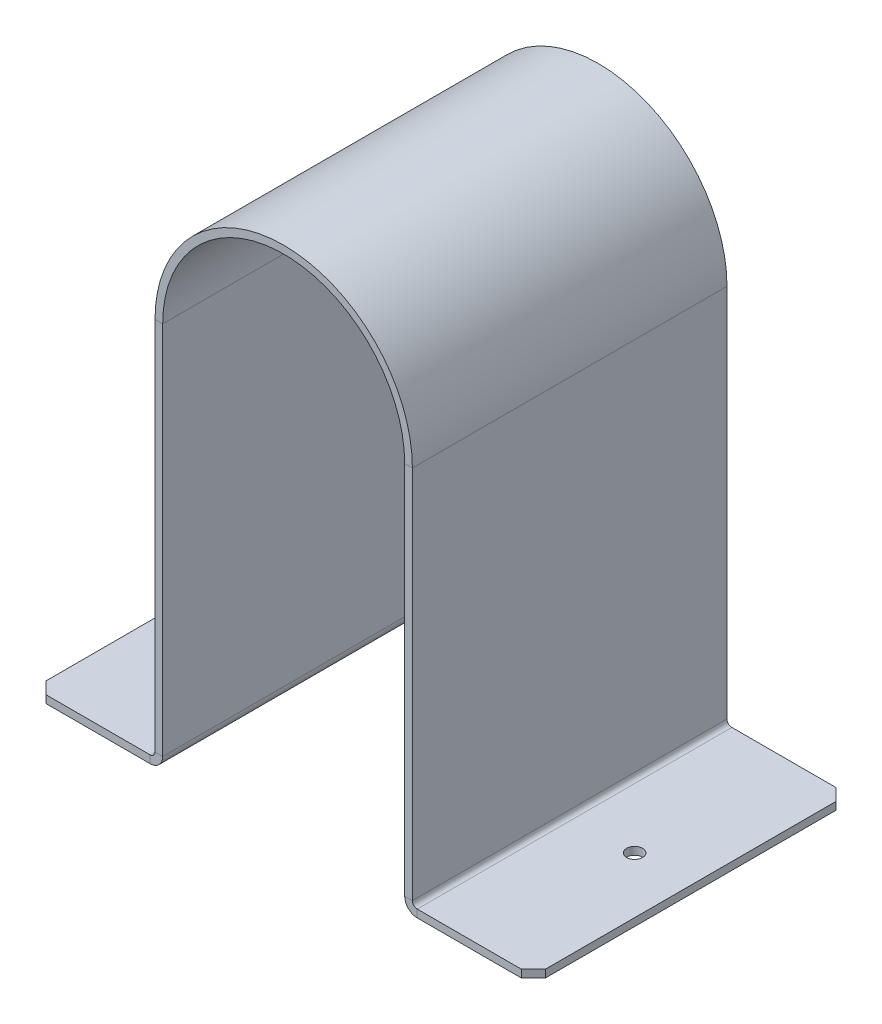
ISO-10303-21;
HEADER;
FILE_DESCRIPTION(('STEP AP214'),'2;1');
FILE_NAME('part.step','',(''),(''),'','','');
FILE_SCHEMA(('AUTOMOTIVE_DESIGN { 1 0 10303 214 1 1 1 1 }'));
ENDSEC;
DATA;
#1=APPLICATION_CONTEXT('core data for automotive mechanical design processes');
#2=APPLICATION_PROTOCOL_DEFINITION('international standard','automotive_design',2000,#1);
#3=PRODUCT_CONTEXT('',#1,'mechanical');
#4=PRODUCT('Part','Part','',(#3));
#5=PRODUCT_RELATED_PRODUCT_CATEGORY('part','',(#4));
#6=PRODUCT_DEFINITION_FORMATION('','',#4);
#7=PRODUCT_DEFINITION_CONTEXT('part definition',#1,'design');
#8=PRODUCT_DEFINITION('design','',#6,#7);
#9=PRODUCT_DEFINITION_SHAPE('','',#8);
#10=(LENGTH_UNIT() NAMED_UNIT(*) SI_UNIT(.MILLI.,.METRE.));
#11=(NAMED_UNIT(*) PLANE_ANGLE_UNIT() SI_UNIT($,.RADIAN.));
#12=(NAMED_UNIT(*) SI_UNIT($,.STERADIAN.) SOLID_ANGLE_UNIT());
#13=UNCERTAINTY_MEASURE_WITH_UNIT(LENGTH_MEASURE(1.E-05),#10,'distance_accuracy_value','');
#14=(GEOMETRIC_REPRESENTATION_CONTEXT(3) GLOBAL_UNCERTAINTY_ASSIGNED_CONTEXT((#13)) GLOBAL_UNIT_ASSIGNED_CONTEXT((#10,
#11,#12)) REPRESENTATION_CONTEXT('',''));
#15=CARTESIAN_POINT('',(0.,0.,0.));
#16=DIRECTION('',(0.,0.,1.));
#17=DIRECTION('',(1.,0.,0.));
#18=AXIS2_PLACEMENT_3D('',#15,#16,#17);
#19=CARTESIAN_POINT('',(53.175,0.,130.));
#20=DIRECTION('',(0.,0.,1.));
#21=DIRECTION('',(1.,0.,0.));
#22=AXIS2_PLACEMENT_3D('',#19,#20,#21);
#23=PLANE('',#22);
#24=DIRECTION('',(0.,-1.,0.));
#25=VECTOR('',#24,1.);
#26=CARTESIAN_POINT('',(-53.175,0.,130.));
#27=LINE('',#26,#25);
#28=CARTESIAN_POINT('',(-53.175,0.,130.));
#29=VERTEX_POINT('',#28);
#30=CARTESIAN_POINT('',(-53.175,-154.825,130.));
#31=VERTEX_POINT('',#30);
#32=EDGE_CURVE('E330',#29,#31,#27,.T.);
#33=ORIENTED_EDGE('',*,*,#32,.T.);
#34=DIRECTION('',(1.,0.,0.));
#35=VECTOR('',#34,1.);
#36=CARTESIAN_POINT('',(-53.175,-154.825,130.));
#37=LINE('',#36,#35);
#38=CARTESIAN_POINT('',(-50.,-154.825,130.));
#39=VERTEX_POINT('',#38);
#40=EDGE_CURVE('E270',#31,#39,#37,.T.);
#41=ORIENTED_EDGE('',*,*,#40,.T.);
#42=DIRECTION('',(0.,-1.,0.));
#43=VECTOR('',#42,1.);
#44=CARTESIAN_POINT('',(-50.,0.,130.));
#45=LINE('',#44,#43);
#46=CARTESIAN_POINT('',(-50.,0.,130.));
#47=VERTEX_POINT('',#46);
#48=EDGE_CURVE('E333',#47,#39,#45,.T.);
#49=ORIENTED_EDGE('',*,*,#48,.F.);
#50=DIRECTION('',(-1.,0.,0.));
#51=VECTOR('',#50,1.);
#52=CARTESIAN_POINT('',(-50.,0.,130.));
#53=LINE('',#52,#51);
#54=EDGE_CURVE('E381',#47,#29,#53,.T.);
#55=ORIENTED_EDGE('',*,*,#54,.T.);
#56=EDGE_LOOP('',(#33,#41,#49,#55));
#57=FACE_BOUND('',#56,.T.);
#58=ADVANCED_FACE('F81',(#57),#23,.T.);
#59=CARTESIAN_POINT('',(-53.175,0.,130.));
#60=DIRECTION('',(1.,0.,0.));
#61=DIRECTION('',(0.,1.,0.));
#62=AXIS2_PLACEMENT_3D('',#59,#60,#61);
#63=PLANE('',#62);
#64=DIRECTION('',(0.,0.,1.));
#65=VECTOR('',#64,1.);
#66=CARTESIAN_POINT('',(-53.175,-154.825,130.));
#67=LINE('',#66,#65);
#68=CARTESIAN_POINT('',(-53.175,-154.825,0.));
#69=VERTEX_POINT('',#68);
#70=EDGE_CURVE('E274',#31,#69,#67,.F.);
#71=ORIENTED_EDGE('',*,*,#70,.F.);
#72=ORIENTED_EDGE('',*,*,#32,.F.);
#73=DIRECTION('',(0.,0.,-1.));
#74=VECTOR('',#73,1.);
#75=CARTESIAN_POINT('',(-53.175,0.,130.));
#76=LINE('',#75,#74);
#77=CARTESIAN_POINT('',(-53.175,0.,0.));
#78=VERTEX_POINT('',#77);
#79=EDGE_CURVE('E347',#29,#78,#76,.T.);
#80=ORIENTED_EDGE('',*,*,#79,.T.);
#81=DIRECTION('',(0.,-1.,0.));
#82=VECTOR('',#81,1.);
#83=CARTESIAN_POINT('',(-53.175,0.,0.));
#84=LINE('',#83,#82);
#85=EDGE_CURVE('E327',#78,#69,#84,.T.);
#86=ORIENTED_EDGE('',*,*,#85,.T.);
#87=EDGE_LOOP('',(#71,#72,#80,#86));
#88=FACE_BOUND('',#87,.T.);
#89=ADVANCED_FACE('F454',(#88),#63,.F.);
#90=CARTESIAN_POINT('',(-50.,0.,130.));
#91=DIRECTION('',(1.,0.,0.));
#92=DIRECTION('',(0.,1.,0.));
#93=AXIS2_PLACEMENT_3D('',#90,#91,#92);
#94=PLANE('',#93);
#95=ORIENTED_EDGE('',*,*,#48,.T.);
#96=DIRECTION('',(0.,0.,1.));
#97=VECTOR('',#96,1.);
#98=CARTESIAN_POINT('',(-50.,-154.825,130.));
#99=LINE('',#98,#97);
#100=CARTESIAN_POINT('',(-50.,-154.825,0.));
#101=VERTEX_POINT('',#100);
#102=EDGE_CURVE('E241',#39,#101,#99,.F.);
#103=ORIENTED_EDGE('',*,*,#102,.T.);
#104=DIRECTION('',(0.,-1.,0.));
#105=VECTOR('',#104,1.);
#106=CARTESIAN_POINT('',(-50.,0.,0.));
#107=LINE('',#106,#105);
#108=CARTESIAN_POINT('',(-50.,0.,0.));
#109=VERTEX_POINT('',#108);
#110=EDGE_CURVE('E350',#109,#101,#107,.T.);
#111=ORIENTED_EDGE('',*,*,#110,.F.);
#112=DIRECTION('',(0.,0.,-1.));
#113=VECTOR('',#112,1.);
#114=CARTESIAN_POINT('',(-50.,0.,130.));
#115=LINE('',#114,#113);
#116=EDGE_CURVE('E370',#47,#109,#115,.T.);
#117=ORIENTED_EDGE('',*,*,#116,.F.);
#118=EDGE_LOOP('',(#95,#103,#111,#117));
#119=FACE_BOUND('',#118,.T.);
#120=ADVANCED_FACE('F473',(#119),#94,.T.);
#121=CARTESIAN_POINT('',(0.,0.,0.));
#122=DIRECTION('',(0.,0.,1.));
#123=DIRECTION('',(1.,0.,0.));
#124=AXIS2_PLACEMENT_3D('',#121,#122,#123);
#125=PLANE('',#124);
#126=DIRECTION('',(1.,0.,0.));
#127=VECTOR('',#126,1.);
#128=CARTESIAN_POINT('',(-53.175,-154.825,0.));
#129=LINE('',#128,#127);
#130=EDGE_CURVE('E277',#69,#101,#129,.T.);
#131=ORIENTED_EDGE('',*,*,#130,.F.);
#132=ORIENTED_EDGE('',*,*,#85,.F.);
#133=DIRECTION('',(1.,0.,0.));
#134=VECTOR('',#133,1.);
#135=CARTESIAN_POINT('',(-53.175,0.,0.));
#136=LINE('',#135,#134);
#137=EDGE_CURVE('E373',#78,#109,#136,.T.);
#138=ORIENTED_EDGE('',*,*,#137,.T.);
#139=ORIENTED_EDGE('',*,*,#110,.T.);
#140=EDGE_LOOP('',(#131,#132,#138,#139));
#141=FACE_BOUND('',#140,.T.);
#142=ADVANCED_FACE('F451',(#141),#125,.F.);
#143=CARTESIAN_POINT('',(-53.175,0.,0.));
#144=DIRECTION('',(0.,0.,-1.));
#145=DIRECTION('',(-1.,0.,0.));
#146=AXIS2_PLACEMENT_3D('',#143,#144,#145);
#147=PLANE('',#146);
#148=DIRECTION('',(0.,1.,0.));
#149=VECTOR('',#148,1.);
#150=CARTESIAN_POINT('',(53.175,0.,0.));
#151=LINE('',#150,#149);
#152=CARTESIAN_POINT('',(53.175,-154.825,0.));
#153=VERTEX_POINT('',#152);
#154=CARTESIAN_POINT('',(53.175,0.,0.));
#155=VERTEX_POINT('',#154);
#156=EDGE_CURVE('E358',#153,#155,#151,.T.);
#157=ORIENTED_EDGE('',*,*,#156,.F.);
#158=DIRECTION('',(-1.,0.,0.));
#159=VECTOR('',#158,1.);
#160=CARTESIAN_POINT('',(53.175,-154.825,0.));
#161=LINE('',#160,#159);
#162=CARTESIAN_POINT('',(50.,-154.825,0.));
#163=VERTEX_POINT('',#162);
#164=EDGE_CURVE('E314',#153,#163,#161,.T.);
#165=ORIENTED_EDGE('',*,*,#164,.T.);
#166=DIRECTION('',(0.,1.,0.));
#167=VECTOR('',#166,1.);
#168=CARTESIAN_POINT('',(50.,0.,0.));
#169=LINE('',#168,#167);
#170=CARTESIAN_POINT('',(50.,0.,0.));
#171=VERTEX_POINT('',#170);
#172=EDGE_CURVE('E356',#163,#171,#169,.T.);
#173=ORIENTED_EDGE('',*,*,#172,.T.);
#174=DIRECTION('',(1.,0.,0.));
#175=VECTOR('',#174,1.);
#176=CARTESIAN_POINT('',(50.,0.,0.));
#177=LINE('',#176,#175);
#178=EDGE_CURVE('E375',#171,#155,#177,.T.);
#179=ORIENTED_EDGE('',*,*,#178,.T.);
#180=EDGE_LOOP('',(#157,#165,#173,#179));
#181=FACE_BOUND('',#180,.T.);
#182=ADVANCED_FACE('F486',(#181),#147,.T.);
#183=CARTESIAN_POINT('',(50.,0.,130.));
#184=DIRECTION('',(-1.,0.,0.));
#185=DIRECTION('',(0.,-1.,0.));
#186=AXIS2_PLACEMENT_3D('',#183,#184,#185);
#187=PLANE('',#186);
#188=ORIENTED_EDGE('',*,*,#172,.F.);
#189=DIRECTION('',(0.,0.,-1.));
#190=VECTOR('',#189,1.);
#191=CARTESIAN_POINT('',(50.,-154.825,0.));
#192=LINE('',#191,#190);
#193=CARTESIAN_POINT('',(50.,-154.825,130.));
#194=VERTEX_POINT('',#193);
#195=EDGE_CURVE('E307',#163,#194,#192,.F.);
#196=ORIENTED_EDGE('',*,*,#195,.T.);
#197=DIRECTION('',(0.,1.,0.));
#198=VECTOR('',#197,1.);
#199=CARTESIAN_POINT('',(50.,0.,130.));
#200=LINE('',#199,#198);
#201=CARTESIAN_POINT('',(50.,0.,130.));
#202=VERTEX_POINT('',#201);
#203=EDGE_CURVE('E340',#194,#202,#200,.T.);
#204=ORIENTED_EDGE('',*,*,#203,.T.);
#205=DIRECTION('',(0.,0.,-1.));
#206=VECTOR('',#205,1.);
#207=CARTESIAN_POINT('',(50.,0.,130.));
#208=LINE('',#207,#206);
#209=EDGE_CURVE('E367',#202,#171,#208,.T.);
#210=ORIENTED_EDGE('',*,*,#209,.T.);
#211=EDGE_LOOP('',(#188,#196,#204,#210));
#212=FACE_BOUND('',#211,.T.);
#213=ADVANCED_FACE('F489',(#212),#187,.T.);
#214=CARTESIAN_POINT('',(53.175,0.,130.));
#215=DIRECTION('',(-1.,0.,0.));
#216=DIRECTION('',(0.,-1.,0.));
#217=AXIS2_PLACEMENT_3D('',#214,#215,#216);
#218=PLANE('',#217);
#219=DIRECTION('',(0.,0.,-1.));
#220=VECTOR('',#219,1.);
#221=CARTESIAN_POINT('',(53.175,-154.825,0.));
#222=LINE('',#221,#220);
#223=CARTESIAN_POINT('',(53.175,-154.825,130.));
#224=VERTEX_POINT('',#223);
#225=EDGE_CURVE('E320',#153,#224,#222,.F.);
#226=ORIENTED_EDGE('',*,*,#225,.F.);
#227=ORIENTED_EDGE('',*,*,#156,.T.);
#228=DIRECTION('',(0.,0.,-1.));
#229=VECTOR('',#228,1.);
#230=CARTESIAN_POINT('',(53.175,0.,130.));
#231=LINE('',#230,#229);
#232=CARTESIAN_POINT('',(53.175,0.,130.));
#233=VERTEX_POINT('',#232);
#234=EDGE_CURVE('E364',#233,#155,#231,.T.);
#235=ORIENTED_EDGE('',*,*,#234,.F.);
#236=DIRECTION('',(0.,1.,0.));
#237=VECTOR('',#236,1.);
#238=CARTESIAN_POINT('',(53.175,0.,130.));
#239=LINE('',#238,#237);
#240=EDGE_CURVE('E342',#224,#233,#239,.T.);
#241=ORIENTED_EDGE('',*,*,#240,.F.);
#242=EDGE_LOOP('',(#226,#227,#235,#241));
#243=FACE_BOUND('',#242,.T.);
#244=ADVANCED_FACE('F483',(#243),#218,.F.);
#245=CARTESIAN_POINT('',(-50.,0.,130.));
#246=DIRECTION('',(0.,0.,1.));
#247=DIRECTION('',(1.,0.,0.));
#248=AXIS2_PLACEMENT_3D('',#245,#246,#247);
#249=PLANE('',#248);
#250=ORIENTED_EDGE('',*,*,#54,.F.);
#251=CARTESIAN_POINT('',(0.,0.,130.));
#252=DIRECTION('',(0.,0.,1.));
#253=DIRECTION('',(1.,0.,0.));
#254=AXIS2_PLACEMENT_3D('',#251,#252,#253);
#255=CIRCLE('',#254,50.);
#256=EDGE_CURVE('E337',#202,#47,#255,.T.);
#257=ORIENTED_EDGE('',*,*,#256,.F.);
#258=DIRECTION('',(-1.,0.,0.));
#259=VECTOR('',#258,1.);
#260=CARTESIAN_POINT('',(53.175,0.,130.));
#261=LINE('',#260,#259);
#262=EDGE_CURVE('E378',#233,#202,#261,.T.);
#263=ORIENTED_EDGE('',*,*,#262,.F.);
#264=CARTESIAN_POINT('',(0.,0.,130.));
#265=DIRECTION('',(0.,0.,1.));
#266=DIRECTION('',(1.,0.,0.));
#267=AXIS2_PLACEMENT_3D('',#264,#265,#266);
#268=CIRCLE('',#267,53.175);
#269=EDGE_CURVE('E344',#233,#29,#268,.T.);
#270=ORIENTED_EDGE('',*,*,#269,.T.);
#271=EDGE_LOOP('',(#250,#257,#263,#270));
#272=FACE_BOUND('',#271,.T.);
#273=ADVANCED_FACE('F477',(#272),#249,.T.);
#274=CARTESIAN_POINT('',(50.,0.,0.));
#275=DIRECTION('',(0.,0.,-1.));
#276=DIRECTION('',(-1.,0.,0.));
#277=AXIS2_PLACEMENT_3D('',#274,#275,#276);
#278=PLANE('',#277);
#279=ORIENTED_EDGE('',*,*,#178,.F.);
#280=CARTESIAN_POINT('',(0.,0.,0.));
#281=DIRECTION('',(0.,0.,1.));
#282=DIRECTION('',(1.,0.,0.));
#283=AXIS2_PLACEMENT_3D('',#280,#281,#282);
#284=CIRCLE('',#283,50.);
#285=EDGE_CURVE('E353',#171,#109,#284,.T.);
#286=ORIENTED_EDGE('',*,*,#285,.T.);
#287=ORIENTED_EDGE('',*,*,#137,.F.);
#288=CARTESIAN_POINT('',(0.,0.,0.));
#289=DIRECTION('',(0.,0.,1.));
#290=DIRECTION('',(1.,0.,0.));
#291=AXIS2_PLACEMENT_3D('',#288,#289,#290);
#292=CIRCLE('',#291,53.175);
#293=EDGE_CURVE('E334',#155,#78,#292,.T.);
#294=ORIENTED_EDGE('',*,*,#293,.F.);
#295=EDGE_LOOP('',(#279,#286,#287,#294));
#296=FACE_BOUND('',#295,.T.);
#297=ADVANCED_FACE('F464',(#296),#278,.T.);
#298=CARTESIAN_POINT('',(0.,0.,130.));
#299=DIRECTION('',(0.,0.,-1.));
#300=DIRECTION('',(-1.,0.,0.));
#301=AXIS2_PLACEMENT_3D('',#298,#299,#300);
#302=CYLINDRICAL_SURFACE('',#301,50.);
#303=ORIENTED_EDGE('',*,*,#285,.F.);
#304=ORIENTED_EDGE('',*,*,#209,.F.);
#305=ORIENTED_EDGE('',*,*,#256,.T.);
#306=ORIENTED_EDGE('',*,*,#116,.T.);
#307=EDGE_LOOP('',(#303,#304,#305,#306));
#308=FACE_BOUND('',#307,.T.);
#309=ADVANCED_FACE('F468',(#308),#302,.F.);
#310=CARTESIAN_POINT('',(0.,0.,130.));
#311=DIRECTION('',(0.,0.,-1.));
#312=DIRECTION('',(-1.,0.,0.));
#313=AXIS2_PLACEMENT_3D('',#310,#311,#312);
#314=CYLINDRICAL_SURFACE('',#313,53.175);
#315=ORIENTED_EDGE('',*,*,#293,.T.);
#316=ORIENTED_EDGE('',*,*,#79,.F.);
#317=ORIENTED_EDGE('',*,*,#269,.F.);
#318=ORIENTED_EDGE('',*,*,#234,.T.);
#319=EDGE_LOOP('',(#315,#316,#317,#318));
#320=FACE_BOUND('',#319,.T.);
#321=ADVANCED_FACE('F459',(#320),#314,.T.);
#322=CARTESIAN_POINT('',(0.,0.,130.));
#323=DIRECTION('',(0.,0.,1.));
#324=DIRECTION('',(1.,0.,0.));
#325=AXIS2_PLACEMENT_3D('',#322,#323,#324);
#326=PLANE('',#325);
#327=DIRECTION('',(-1.,0.,0.));
#328=VECTOR('',#327,1.);
#329=CARTESIAN_POINT('',(53.175,-154.825,130.));
#330=LINE('',#329,#328);
#331=EDGE_CURVE('E324',#224,#194,#330,.T.);
#332=ORIENTED_EDGE('',*,*,#331,.F.);
#333=ORIENTED_EDGE('',*,*,#240,.T.);
#334=ORIENTED_EDGE('',*,*,#262,.T.);
#335=ORIENTED_EDGE('',*,*,#203,.F.);
#336=EDGE_LOOP('',(#332,#333,#334,#335));
#337=FACE_BOUND('',#336,.T.);
#338=ADVANCED_FACE('F491',(#337),#326,.T.);
#339=CARTESIAN_POINT('',(55.175,-154.825,130.));
#340=DIRECTION('',(0.,0.,1.));
#341=DIRECTION('',(1.,0.,0.));
#342=AXIS2_PLACEMENT_3D('',#339,#340,#341);
#343=PLANE('',#342);
#344=DIRECTION('',(0.,1.,0.));
#345=VECTOR('',#344,1.);
#346=CARTESIAN_POINT('',(55.175,-160.,130.));
#347=LINE('',#346,#345);
#348=CARTESIAN_POINT('',(55.175,-156.825,130.));
#349=VERTEX_POINT('',#348);
#350=CARTESIAN_POINT('',(55.175,-160.,130.));
#351=VERTEX_POINT('',#350);
#352=EDGE_CURVE('E280',#349,#351,#347,.F.);
#353=ORIENTED_EDGE('',*,*,#352,.F.);
#354=CARTESIAN_POINT('',(55.175,-154.825,130.));
#355=DIRECTION('',(0.,0.,-1.));
#356=DIRECTION('',(-1.,0.,0.));
#357=AXIS2_PLACEMENT_3D('',#354,#355,#356);
#358=CIRCLE('',#357,2.);
#359=EDGE_CURVE('E317',#224,#349,#358,.F.);
#360=ORIENTED_EDGE('',*,*,#359,.F.);
#361=ORIENTED_EDGE('',*,*,#331,.T.);
#362=CARTESIAN_POINT('',(55.175,-154.825,130.));
#363=DIRECTION('',(0.,0.,-1.));
#364=DIRECTION('',(-1.,0.,0.));
#365=AXIS2_PLACEMENT_3D('',#362,#363,#364);
#366=CIRCLE('',#365,5.175);
#367=EDGE_CURVE('E310',#194,#351,#366,.F.);
#368=ORIENTED_EDGE('',*,*,#367,.T.);
#369=EDGE_LOOP('',(#353,#360,#361,#368));
#370=FACE_BOUND('',#369,.T.);
#371=ADVANCED_FACE('F495',(#370),#343,.T.);
#372=CARTESIAN_POINT('',(55.175,-154.825,0.));
#373=DIRECTION('',(0.,0.,1.));
#374=DIRECTION('',(1.,0.,0.));
#375=AXIS2_PLACEMENT_3D('',#372,#373,#374);
#376=PLANE('',#375);
#377=CARTESIAN_POINT('',(55.175,-154.825,0.));
#378=DIRECTION('',(0.,0.,-1.));
#379=DIRECTION('',(-1.,0.,0.));
#380=AXIS2_PLACEMENT_3D('',#377,#378,#379);
#381=CIRCLE('',#380,2.);
#382=CARTESIAN_POINT('',(55.175,-156.825,0.));
#383=VERTEX_POINT('',#382);
#384=EDGE_CURVE('E284',#383,#153,#381,.T.);
#385=ORIENTED_EDGE('',*,*,#384,.F.);
#386=DIRECTION('',(0.,1.,0.));
#387=VECTOR('',#386,1.);
#388=CARTESIAN_POINT('',(55.175,-156.825,0.));
#389=LINE('',#388,#387);
#390=CARTESIAN_POINT('',(55.175,-160.,0.));
#391=VERTEX_POINT('',#390);
#392=EDGE_CURVE('E300',#383,#391,#389,.F.);
#393=ORIENTED_EDGE('',*,*,#392,.T.);
#394=CARTESIAN_POINT('',(55.175,-154.825,0.));
#395=DIRECTION('',(0.,0.,-1.));
#396=DIRECTION('',(-1.,0.,0.));
#397=AXIS2_PLACEMENT_3D('',#394,#395,#396);
#398=CIRCLE('',#397,5.175);
#399=EDGE_CURVE('E311',#391,#163,#398,.T.);
#400=ORIENTED_EDGE('',*,*,#399,.T.);
#401=ORIENTED_EDGE('',*,*,#164,.F.);
#402=EDGE_LOOP('',(#385,#393,#400,#401));
#403=FACE_BOUND('',#402,.T.);
#404=ADVANCED_FACE('F608',(#403),#376,.F.);
#405=CARTESIAN_POINT('',(55.175,-154.825,0.));
#406=DIRECTION('',(0.,0.,-1.));
#407=DIRECTION('',(0.,-1.,0.));
#408=AXIS2_PLACEMENT_3D('',#405,#406,#407);
#409=CYLINDRICAL_SURFACE('',#408,5.175);
#410=ORIENTED_EDGE('',*,*,#195,.F.);
#411=ORIENTED_EDGE('',*,*,#399,.F.);
#412=DIRECTION('',(0.,0.,-1.));
#413=VECTOR('',#412,1.);
#414=CARTESIAN_POINT('',(55.175,-160.,130.));
#415=LINE('',#414,#413);
#416=EDGE_CURVE('E297',#391,#351,#415,.F.);
#417=ORIENTED_EDGE('',*,*,#416,.T.);
#418=ORIENTED_EDGE('',*,*,#367,.F.);
#419=EDGE_LOOP('',(#410,#411,#417,#418));
#420=FACE_BOUND('',#419,.T.);
#421=ADVANCED_FACE('F605',(#420),#409,.T.);
#422=CARTESIAN_POINT('',(55.175,-154.825,0.));
#423=DIRECTION('',(0.,0.,-1.));
#424=DIRECTION('',(0.,-1.,0.));
#425=AXIS2_PLACEMENT_3D('',#422,#423,#424);
#426=CYLINDRICAL_SURFACE('',#425,2.);
#427=ORIENTED_EDGE('',*,*,#225,.T.);
#428=ORIENTED_EDGE('',*,*,#359,.T.);
#429=DIRECTION('',(0.,0.,-1.));
#430=VECTOR('',#429,1.);
#431=CARTESIAN_POINT('',(55.175,-156.825,130.));
#432=LINE('',#431,#430);
#433=EDGE_CURVE('E303',#349,#383,#432,.T.);
#434=ORIENTED_EDGE('',*,*,#433,.T.);
#435=ORIENTED_EDGE('',*,*,#384,.T.);
#436=EDGE_LOOP('',(#427,#428,#434,#435));
#437=FACE_BOUND('',#436,.T.);
#438=ADVANCED_FACE('F498',(#437),#426,.F.);
#439=CARTESIAN_POINT('',(103.175,-160.,0.));
#440=DIRECTION('',(0.,0.,1.));
#441=DIRECTION('',(1.,0.,0.));
#442=AXIS2_PLACEMENT_3D('',#439,#440,#441);
#443=PLANE('',#442);
#444=DIRECTION('',(-1.,0.,0.));
#445=VECTOR('',#444,1.);
#446=CARTESIAN_POINT('',(103.175,-156.825,0.));
#447=LINE('',#446,#445);
#448=CARTESIAN_POINT('',(98.175,-156.825,0.));
#449=VERTEX_POINT('',#448);
#450=EDGE_CURVE('E294',#383,#449,#447,.F.);
#451=ORIENTED_EDGE('',*,*,#450,.T.);
#452=DIRECTION('',(0.,-1.,0.));
#453=VECTOR('',#452,1.);
#454=CARTESIAN_POINT('',(98.1749999999999,-160.,0.));
#455=LINE('',#454,#453);
#456=CARTESIAN_POINT('',(98.1749999999999,-160.,0.));
#457=VERTEX_POINT('',#456);
#458=EDGE_CURVE('E399',#449,#457,#455,.T.);
#459=ORIENTED_EDGE('',*,*,#458,.T.);
#460=DIRECTION('',(1.,0.,0.));
#461=VECTOR('',#460,1.);
#462=CARTESIAN_POINT('',(-6.32810347040914E-13,-160.,0.));
#463=LINE('',#462,#461);
#464=EDGE_CURVE('E287',#391,#457,#463,.T.);
#465=ORIENTED_EDGE('',*,*,#464,.F.);
#466=ORIENTED_EDGE('',*,*,#392,.F.);
#467=EDGE_LOOP('',(#451,#459,#465,#466));
#468=FACE_BOUND('',#467,.T.);
#469=ADVANCED_FACE('F508',(#468),#443,.F.);
#470=CARTESIAN_POINT('',(53.175,-160.,130.));
#471=DIRECTION('',(0.,0.,-1.));
#472=DIRECTION('',(-1.,0.,0.));
#473=AXIS2_PLACEMENT_3D('',#470,#471,#472);
#474=PLANE('',#473);
#475=DIRECTION('',(-1.,0.,0.));
#476=VECTOR('',#475,1.);
#477=CARTESIAN_POINT('',(-6.32810347040914E-13,-160.,130.));
#478=LINE('',#477,#476);
#479=CARTESIAN_POINT('',(98.1749999999999,-160.,130.));
#480=VERTEX_POINT('',#479);
#481=EDGE_CURVE('E282',#480,#351,#478,.T.);
#482=ORIENTED_EDGE('',*,*,#481,.F.);
#483=DIRECTION('',(0.,1.,0.));
#484=VECTOR('',#483,1.);
#485=CARTESIAN_POINT('',(98.1749999999999,-160.,130.));
#486=LINE('',#485,#484);
#487=CARTESIAN_POINT('',(98.175,-156.825,130.));
#488=VERTEX_POINT('',#487);
#489=EDGE_CURVE('E383',#480,#488,#486,.T.);
#490=ORIENTED_EDGE('',*,*,#489,.T.);
#491=DIRECTION('',(1.,0.,0.));
#492=VECTOR('',#491,1.);
#493=CARTESIAN_POINT('',(53.175,-156.825,130.));
#494=LINE('',#493,#492);
#495=EDGE_CURVE('E290',#488,#349,#494,.F.);
#496=ORIENTED_EDGE('',*,*,#495,.T.);
#497=ORIENTED_EDGE('',*,*,#352,.T.);
#498=EDGE_LOOP('',(#482,#490,#496,#497));
#499=FACE_BOUND('',#498,.T.);
#500=ADVANCED_FACE('F527',(#499),#474,.F.);
#501=CARTESIAN_POINT('',(-6.32810347040914E-13,-160.,0.));
#502=DIRECTION('',(0.,1.,0.));
#503=DIRECTION('',(-1.,0.,0.));
#504=AXIS2_PLACEMENT_3D('',#501,#502,#503);
#505=PLANE('',#504);
#506=CARTESIAN_POINT('',(79.9999999999994,-160.,65.));
#507=DIRECTION('',(0.,-1.,0.));
#508=DIRECTION('',(1.,0.,0.));
#509=AXIS2_PLACEMENT_3D('',#506,#507,#508);
#510=CIRCLE('',#509,3.3);
#511=CARTESIAN_POINT('',(83.2999999999994,-160.,65.));
#512=VERTEX_POINT('',#511);
#513=EDGE_CURVE('E416',#512,#512,#510,.T.);
#514=ORIENTED_EDGE('',*,*,#513,.F.);
#515=EDGE_LOOP('',(#514));
#516=FACE_BOUND('',#515,.T.);
#517=ORIENTED_EDGE('',*,*,#464,.T.);
#518=DIRECTION('',(-0.707106781186548,0.,-0.707106781186548));
#519=VECTOR('',#518,1.);
#520=CARTESIAN_POINT('',(103.175,-160.,5.00000000000003));
#521=LINE('',#520,#519);
#522=CARTESIAN_POINT('',(103.175,-160.,5.00000000000003));
#523=VERTEX_POINT('',#522);
#524=EDGE_CURVE('E401',#457,#523,#521,.F.);
#525=ORIENTED_EDGE('',*,*,#524,.T.);
#526=DIRECTION('',(0.,0.,1.));
#527=VECTOR('',#526,1.);
#528=CARTESIAN_POINT('',(103.175,-160.,0.));
#529=LINE('',#528,#527);
#530=CARTESIAN_POINT('',(103.175,-160.,125.));
#531=VERTEX_POINT('',#530);
#532=EDGE_CURVE('E285',#523,#531,#529,.T.);
#533=ORIENTED_EDGE('',*,*,#532,.T.);
#534=DIRECTION('',(0.707106781186548,0.,-0.707106781186548));
#535=VECTOR('',#534,1.);
#536=CARTESIAN_POINT('',(98.1749999999999,-160.,130.));
#537=LINE('',#536,#535);
#538=EDGE_CURVE('E392',#531,#480,#537,.F.);
#539=ORIENTED_EDGE('',*,*,#538,.T.);
#540=ORIENTED_EDGE('',*,*,#481,.T.);
#541=ORIENTED_EDGE('',*,*,#416,.F.);
#542=EDGE_LOOP('',(#517,#525,#533,#539,#540,#541));
#543=FACE_BOUND('',#542,.T.);
#544=ADVANCED_FACE('F516',(#516,#543),#505,.F.);
#545=CARTESIAN_POINT('',(-6.2131181276237E-13,-156.825,0.));
#546=DIRECTION('',(0.,1.,0.));
#547=DIRECTION('',(-1.,0.,0.));
#548=AXIS2_PLACEMENT_3D('',#545,#546,#547);
#549=PLANE('',#548);
#550=CARTESIAN_POINT('',(79.9999999999994,-156.825,65.));
#551=DIRECTION('',(0.,1.,0.));
#552=DIRECTION('',(-1.,0.,0.));
#553=AXIS2_PLACEMENT_3D('',#550,#551,#552);
#554=CIRCLE('',#553,3.3);
#555=CARTESIAN_POINT('',(76.6999999999994,-156.825,65.));
#556=VERTEX_POINT('',#555);
#557=EDGE_CURVE('E267',#556,#556,#554,.T.);
#558=ORIENTED_EDGE('',*,*,#557,.F.);
#559=EDGE_LOOP('',(#558));
#560=FACE_BOUND('',#559,.T.);
#561=DIRECTION('',(0.,0.,-1.));
#562=VECTOR('',#561,1.);
#563=CARTESIAN_POINT('',(103.175,-156.825,130.));
#564=LINE('',#563,#562);
#565=CARTESIAN_POINT('',(103.175,-156.825,5.00000000000003));
#566=VERTEX_POINT('',#565);
#567=CARTESIAN_POINT('',(103.175,-156.825,125.));
#568=VERTEX_POINT('',#567);
#569=EDGE_CURVE('E292',#566,#568,#564,.F.);
#570=ORIENTED_EDGE('',*,*,#569,.F.);
#571=DIRECTION('',(0.707106781186548,0.,0.707106781186548));
#572=VECTOR('',#571,1.);
#573=CARTESIAN_POINT('',(49.0874999999997,-156.825,-49.0875000000003));
#574=LINE('',#573,#572);
#575=EDGE_CURVE('E397',#566,#449,#574,.F.);
#576=ORIENTED_EDGE('',*,*,#575,.T.);
#577=ORIENTED_EDGE('',*,*,#450,.F.);
#578=ORIENTED_EDGE('',*,*,#433,.F.);
#579=ORIENTED_EDGE('',*,*,#495,.F.);
#580=DIRECTION('',(-0.707106781186548,0.,0.707106781186548));
#581=VECTOR('',#580,1.);
#582=CARTESIAN_POINT('',(114.0875,-156.825,114.0875));
#583=LINE('',#582,#581);
#584=EDGE_CURVE('E386',#488,#568,#583,.F.);
#585=ORIENTED_EDGE('',*,*,#584,.T.);
#586=EDGE_LOOP('',(#570,#576,#577,#578,#579,#585));
#587=FACE_BOUND('',#586,.T.);
#588=ADVANCED_FACE('F504',(#560,#587),#549,.T.);
#589=CARTESIAN_POINT('',(103.175,-160.,130.));
#590=DIRECTION('',(-1.,0.,0.));
#591=DIRECTION('',(0.,-1.,0.));
#592=AXIS2_PLACEMENT_3D('',#589,#590,#591);
#593=PLANE('',#592);
#594=ORIENTED_EDGE('',*,*,#532,.F.);
#595=DIRECTION('',(0.,1.,0.));
#596=VECTOR('',#595,1.);
#597=CARTESIAN_POINT('',(103.175,-160.,5.00000000000003));
#598=LINE('',#597,#596);
#599=EDGE_CURVE('E394',#523,#566,#598,.T.);
#600=ORIENTED_EDGE('',*,*,#599,.T.);
#601=ORIENTED_EDGE('',*,*,#569,.T.);
#602=DIRECTION('',(0.,-1.,0.));
#603=VECTOR('',#602,1.);
#604=CARTESIAN_POINT('',(103.175,-160.,125.));
#605=LINE('',#604,#603);
#606=EDGE_CURVE('E389',#568,#531,#605,.T.);
#607=ORIENTED_EDGE('',*,*,#606,.T.);
#608=EDGE_LOOP('',(#594,#600,#601,#607));
#609=FACE_BOUND('',#608,.T.);
#610=ADVANCED_FACE('F519',(#609),#593,.F.);
#611=CARTESIAN_POINT('',(-55.175,-154.825,0.));
#612=DIRECTION('',(0.,0.,-1.));
#613=DIRECTION('',(-1.,0.,0.));
#614=AXIS2_PLACEMENT_3D('',#611,#612,#613);
#615=PLANE('',#614);
#616=DIRECTION('',(0.,-1.,0.));
#617=VECTOR('',#616,1.);
#618=CARTESIAN_POINT('',(-55.175,-160.,0.));
#619=LINE('',#618,#617);
#620=CARTESIAN_POINT('',(-55.175,-156.825,0.));
#621=VERTEX_POINT('',#620);
#622=CARTESIAN_POINT('',(-55.175,-160.,0.));
#623=VERTEX_POINT('',#622);
#624=EDGE_CURVE('E264',#621,#623,#619,.T.);
#625=ORIENTED_EDGE('',*,*,#624,.F.);
#626=CARTESIAN_POINT('',(-55.175,-154.825,0.));
#627=DIRECTION('',(0.,0.,1.));
#628=DIRECTION('',(1.,0.,0.));
#629=AXIS2_PLACEMENT_3D('',#626,#627,#628);
#630=CIRCLE('',#629,2.);
#631=EDGE_CURVE('E244',#69,#621,#630,.F.);
#632=ORIENTED_EDGE('',*,*,#631,.F.);
#633=ORIENTED_EDGE('',*,*,#130,.T.);
#634=CARTESIAN_POINT('',(-55.175,-154.825,0.));
#635=DIRECTION('',(0.,0.,1.));
#636=DIRECTION('',(1.,0.,0.));
#637=AXIS2_PLACEMENT_3D('',#634,#635,#636);
#638=CIRCLE('',#637,5.175);
#639=EDGE_CURVE('E269',#101,#623,#638,.F.);
#640=ORIENTED_EDGE('',*,*,#639,.T.);
#641=EDGE_LOOP('',(#625,#632,#633,#640));
#642=FACE_BOUND('',#641,.T.);
#643=ADVANCED_FACE('F448',(#642),#615,.T.);
#644=CARTESIAN_POINT('',(-55.175,-154.825,130.));
#645=DIRECTION('',(0.,0.,-1.));
#646=DIRECTION('',(-1.,0.,0.));
#647=AXIS2_PLACEMENT_3D('',#644,#645,#646);
#648=PLANE('',#647);
#649=CARTESIAN_POINT('',(-55.175,-154.825,130.));
#650=DIRECTION('',(0.,0.,1.));
#651=DIRECTION('',(1.,0.,0.));
#652=AXIS2_PLACEMENT_3D('',#649,#650,#651);
#653=CIRCLE('',#652,2.);
#654=CARTESIAN_POINT('',(-55.175,-156.825,130.));
#655=VERTEX_POINT('',#654);
#656=EDGE_CURVE('E249',#655,#31,#653,.T.);
#657=ORIENTED_EDGE('',*,*,#656,.F.);
#658=DIRECTION('',(0.,-1.,0.));
#659=VECTOR('',#658,1.);
#660=CARTESIAN_POINT('',(-55.175,-156.825,130.));
#661=LINE('',#660,#659);
#662=CARTESIAN_POINT('',(-55.175,-160.,130.));
#663=VERTEX_POINT('',#662);
#664=EDGE_CURVE('E224',#655,#663,#661,.T.);
#665=ORIENTED_EDGE('',*,*,#664,.T.);
#666=CARTESIAN_POINT('',(-55.175,-154.825,130.));
#667=DIRECTION('',(0.,0.,1.));
#668=DIRECTION('',(1.,0.,0.));
#669=AXIS2_PLACEMENT_3D('',#666,#667,#668);
#670=CIRCLE('',#669,5.175);
#671=EDGE_CURVE('E236',#663,#39,#670,.T.);
#672=ORIENTED_EDGE('',*,*,#671,.T.);
#673=ORIENTED_EDGE('',*,*,#40,.F.);
#674=EDGE_LOOP('',(#657,#665,#672,#673));
#675=FACE_BOUND('',#674,.T.);
#676=ADVANCED_FACE('F247',(#675),#648,.F.);
#677=CARTESIAN_POINT('',(-55.175,-154.825,130.));
#678=DIRECTION('',(0.,0.,1.));
#679=DIRECTION('',(0.,-1.,0.));
#680=AXIS2_PLACEMENT_3D('',#677,#678,#679);
#681=CYLINDRICAL_SURFACE('',#680,5.175);
#682=ORIENTED_EDGE('',*,*,#102,.F.);
#683=ORIENTED_EDGE('',*,*,#671,.F.);
#684=DIRECTION('',(0.,0.,1.));
#685=VECTOR('',#684,1.);
#686=CARTESIAN_POINT('',(-55.175,-160.,0.));
#687=LINE('',#686,#685);
#688=EDGE_CURVE('E238',#663,#623,#687,.F.);
#689=ORIENTED_EDGE('',*,*,#688,.T.);
#690=ORIENTED_EDGE('',*,*,#639,.F.);
#691=EDGE_LOOP('',(#682,#683,#689,#690));
#692=FACE_BOUND('',#691,.T.);
#693=ADVANCED_FACE('F237',(#692),#681,.T.);
#694=CARTESIAN_POINT('',(-55.175,-154.825,130.));
#695=DIRECTION('',(0.,0.,1.));
#696=DIRECTION('',(0.,-1.,0.));
#697=AXIS2_PLACEMENT_3D('',#694,#695,#696);
#698=CYLINDRICAL_SURFACE('',#697,2.);
#699=ORIENTED_EDGE('',*,*,#70,.T.);
#700=ORIENTED_EDGE('',*,*,#631,.T.);
#701=DIRECTION('',(0.,0.,1.));
#702=VECTOR('',#701,1.);
#703=CARTESIAN_POINT('',(-55.175,-156.825,0.));
#704=LINE('',#703,#702);
#705=EDGE_CURVE('E250',#621,#655,#704,.T.);
#706=ORIENTED_EDGE('',*,*,#705,.T.);
#707=ORIENTED_EDGE('',*,*,#656,.T.);
#708=EDGE_LOOP('',(#699,#700,#706,#707));
#709=FACE_BOUND('',#708,.T.);
#710=ADVANCED_FACE('F443',(#709),#698,.F.);
#711=CARTESIAN_POINT('',(-53.175,-160.,130.));
#712=DIRECTION('',(0.,0.,1.));
#713=DIRECTION('',(1.,0.,0.));
#714=AXIS2_PLACEMENT_3D('',#711,#712,#713);
#715=PLANE('',#714);
#716=DIRECTION('',(1.,0.,0.));
#717=VECTOR('',#716,1.);
#718=CARTESIAN_POINT('',(6.2131181276237E-13,-156.825,130.));
#719=LINE('',#718,#717);
#720=CARTESIAN_POINT('',(-98.175,-156.825,130.));
#721=VERTEX_POINT('',#720);
#722=EDGE_CURVE('E256',#721,#655,#719,.T.);
#723=ORIENTED_EDGE('',*,*,#722,.F.);
#724=DIRECTION('',(0.,-1.,0.));
#725=VECTOR('',#724,1.);
#726=CARTESIAN_POINT('',(-98.1749999999999,-160.,130.));
#727=LINE('',#726,#725);
#728=CARTESIAN_POINT('',(-98.1749999999999,-160.,130.));
#729=VERTEX_POINT('',#728);
#730=EDGE_CURVE('E226',#721,#729,#727,.T.);
#731=ORIENTED_EDGE('',*,*,#730,.T.);
#732=DIRECTION('',(-1.,0.,0.));
#733=VECTOR('',#732,1.);
#734=CARTESIAN_POINT('',(-53.175,-160.,130.));
#735=LINE('',#734,#733);
#736=EDGE_CURVE('E219',#729,#663,#735,.F.);
#737=ORIENTED_EDGE('',*,*,#736,.T.);
#738=ORIENTED_EDGE('',*,*,#664,.F.);
#739=EDGE_LOOP('',(#723,#731,#737,#738));
#740=FACE_BOUND('',#739,.T.);
#741=ADVANCED_FACE('F222',(#740),#715,.T.);
#742=CARTESIAN_POINT('',(-103.175,-160.,0.));
#743=DIRECTION('',(0.,0.,-1.));
#744=DIRECTION('',(-1.,0.,0.));
#745=AXIS2_PLACEMENT_3D('',#742,#743,#744);
#746=PLANE('',#745);
#747=DIRECTION('',(1.,0.,0.));
#748=VECTOR('',#747,1.);
#749=CARTESIAN_POINT('',(-103.175,-160.,0.));
#750=LINE('',#749,#748);
#751=CARTESIAN_POINT('',(-98.1749999999999,-160.,0.));
#752=VERTEX_POINT('',#751);
#753=EDGE_CURVE('E255',#623,#752,#750,.F.);
#754=ORIENTED_EDGE('',*,*,#753,.T.);
#755=DIRECTION('',(0.,1.,0.));
#756=VECTOR('',#755,1.);
#757=CARTESIAN_POINT('',(-98.1749999999999,-160.,0.));
#758=LINE('',#757,#756);
#759=CARTESIAN_POINT('',(-98.175,-156.825,0.));
#760=VERTEX_POINT('',#759);
#761=EDGE_CURVE('E411',#752,#760,#758,.T.);
#762=ORIENTED_EDGE('',*,*,#761,.T.);
#763=DIRECTION('',(-1.,0.,0.));
#764=VECTOR('',#763,1.);
#765=CARTESIAN_POINT('',(6.2131181276237E-13,-156.825,0.));
#766=LINE('',#765,#764);
#767=EDGE_CURVE('E232',#621,#760,#766,.T.);
#768=ORIENTED_EDGE('',*,*,#767,.F.);
#769=ORIENTED_EDGE('',*,*,#624,.T.);
#770=EDGE_LOOP('',(#754,#762,#768,#769));
#771=FACE_BOUND('',#770,.T.);
#772=ADVANCED_FACE('F440',(#771),#746,.T.);
#773=CARTESIAN_POINT('',(6.32810347040914E-13,-160.,0.));
#774=DIRECTION('',(0.,1.,0.));
#775=DIRECTION('',(1.,0.,0.));
#776=AXIS2_PLACEMENT_3D('',#773,#774,#775);
#777=PLANE('',#776);
#778=CARTESIAN_POINT('',(-79.9999999999994,-160.,65.));
#779=DIRECTION('',(0.,-1.,0.));
#780=DIRECTION('',(1.,0.,0.));
#781=AXIS2_PLACEMENT_3D('',#778,#779,#780);
#782=CIRCLE('',#781,3.3);
#783=CARTESIAN_POINT('',(-76.6999999999994,-160.,65.));
#784=VERTEX_POINT('',#783);
#785=EDGE_CURVE('E424',#784,#784,#782,.T.);
#786=ORIENTED_EDGE('',*,*,#785,.F.);
#787=EDGE_LOOP('',(#786));
#788=FACE_BOUND('',#787,.T.);
#789=DIRECTION('',(0.,0.,-1.));
#790=VECTOR('',#789,1.);
#791=CARTESIAN_POINT('',(-103.175,-160.,130.));
#792=LINE('',#791,#790);
#793=CARTESIAN_POINT('',(-103.175,-160.,5.00000000000003));
#794=VERTEX_POINT('',#793);
#795=CARTESIAN_POINT('',(-103.175,-160.,125.));
#796=VERTEX_POINT('',#795);
#797=EDGE_CURVE('E231',#794,#796,#792,.F.);
#798=ORIENTED_EDGE('',*,*,#797,.F.);
#799=DIRECTION('',(-0.707106781186548,0.,0.707106781186548));
#800=VECTOR('',#799,1.);
#801=CARTESIAN_POINT('',(-98.1749999999999,-160.,0.));
#802=LINE('',#801,#800);
#803=EDGE_CURVE('E13',#794,#752,#802,.F.);
#804=ORIENTED_EDGE('',*,*,#803,.T.);
#805=ORIENTED_EDGE('',*,*,#753,.F.);
#806=ORIENTED_EDGE('',*,*,#688,.F.);
#807=ORIENTED_EDGE('',*,*,#736,.F.);
#808=DIRECTION('',(0.707106781186548,0.,0.707106781186548));
#809=VECTOR('',#808,1.);
#810=CARTESIAN_POINT('',(-103.175,-160.,125.));
#811=LINE('',#810,#809);
#812=EDGE_CURVE('E409',#729,#796,#811,.F.);
#813=ORIENTED_EDGE('',*,*,#812,.T.);
#814=EDGE_LOOP('',(#798,#804,#805,#806,#807,#813));
#815=FACE_BOUND('',#814,.T.);
#816=ADVANCED_FACE('F253',(#788,#815),#777,.F.);
#817=CARTESIAN_POINT('',(6.2131181276237E-13,-156.825,0.));
#818=DIRECTION('',(0.,1.,0.));
#819=DIRECTION('',(1.,0.,0.));
#820=AXIS2_PLACEMENT_3D('',#817,#818,#819);
#821=PLANE('',#820);
#822=CARTESIAN_POINT('',(-79.9999999999994,-156.825,65.));
#823=DIRECTION('',(0.,1.,0.));
#824=DIRECTION('',(-1.,0.,0.));
#825=AXIS2_PLACEMENT_3D('',#822,#823,#824);
#826=CIRCLE('',#825,3.3);
#827=CARTESIAN_POINT('',(-83.2999999999994,-156.825,65.));
#828=VERTEX_POINT('',#827);
#829=EDGE_CURVE('E86',#828,#828,#826,.T.);
#830=ORIENTED_EDGE('',*,*,#829,.F.);
#831=EDGE_LOOP('',(#830));
#832=FACE_BOUND('',#831,.T.);
#833=ORIENTED_EDGE('',*,*,#767,.T.);
#834=DIRECTION('',(0.707106781186548,0.,-0.707106781186548));
#835=VECTOR('',#834,1.);
#836=CARTESIAN_POINT('',(-49.0874999999997,-156.825,-49.0875000000003));
#837=LINE('',#836,#835);
#838=CARTESIAN_POINT('',(-103.175,-156.825,5.00000000000003));
#839=VERTEX_POINT('',#838);
#840=EDGE_CURVE('E106',#760,#839,#837,.F.);
#841=ORIENTED_EDGE('',*,*,#840,.T.);
#842=DIRECTION('',(0.,0.,1.));
#843=VECTOR('',#842,1.);
#844=CARTESIAN_POINT('',(-103.175,-156.825,0.));
#845=LINE('',#844,#843);
#846=CARTESIAN_POINT('',(-103.175,-156.825,125.));
#847=VERTEX_POINT('',#846);
#848=EDGE_CURVE('E258',#839,#847,#845,.T.);
#849=ORIENTED_EDGE('',*,*,#848,.T.);
#850=DIRECTION('',(-0.707106781186548,0.,-0.707106781186548));
#851=VECTOR('',#850,1.);
#852=CARTESIAN_POINT('',(-114.0875,-156.825,114.0875));
#853=LINE('',#852,#851);
#854=EDGE_CURVE('E406',#847,#721,#853,.F.);
#855=ORIENTED_EDGE('',*,*,#854,.T.);
#856=ORIENTED_EDGE('',*,*,#722,.T.);
#857=ORIENTED_EDGE('',*,*,#705,.F.);
#858=EDGE_LOOP('',(#833,#841,#849,#855,#856,#857));
#859=FACE_BOUND('',#858,.T.);
#860=ADVANCED_FACE('F430',(#832,#859),#821,.T.);
#861=CARTESIAN_POINT('',(-103.175,-160.,130.));
#862=DIRECTION('',(-1.,0.,0.));
#863=DIRECTION('',(0.,-1.,0.));
#864=AXIS2_PLACEMENT_3D('',#861,#862,#863);
#865=PLANE('',#864);
#866=ORIENTED_EDGE('',*,*,#848,.F.);
#867=DIRECTION('',(0.,-1.,0.));
#868=VECTOR('',#867,1.);
#869=CARTESIAN_POINT('',(-103.175,-160.,5.00000000000003));
#870=LINE('',#869,#868);
#871=EDGE_CURVE('E91',#839,#794,#870,.T.);
#872=ORIENTED_EDGE('',*,*,#871,.T.);
#873=ORIENTED_EDGE('',*,*,#797,.T.);
#874=DIRECTION('',(0.,1.,0.));
#875=VECTOR('',#874,1.);
#876=CARTESIAN_POINT('',(-103.175,-160.,125.));
#877=LINE('',#876,#875);
#878=EDGE_CURVE('E403',#796,#847,#877,.T.);
#879=ORIENTED_EDGE('',*,*,#878,.T.);
#880=EDGE_LOOP('',(#866,#872,#873,#879));
#881=FACE_BOUND('',#880,.T.);
#882=ADVANCED_FACE('F434',(#881),#865,.T.);
#883=CARTESIAN_POINT('',(98.1749999999999,-160.,130.));
#884=DIRECTION('',(-0.707106781186547,0.,-0.707106781186547));
#885=DIRECTION('',(0.,1.,0.));
#886=AXIS2_PLACEMENT_3D('',#883,#884,#885);
#887=PLANE('',#886);
#888=ORIENTED_EDGE('',*,*,#538,.F.);
#889=ORIENTED_EDGE('',*,*,#606,.F.);
#890=ORIENTED_EDGE('',*,*,#584,.F.);
#891=ORIENTED_EDGE('',*,*,#489,.F.);
#892=EDGE_LOOP('',(#888,#889,#890,#891));
#893=FACE_BOUND('',#892,.T.);
#894=ADVANCED_FACE('F524',(#893),#887,.F.);
#895=CARTESIAN_POINT('',(103.175,-160.,5.00000000000003));
#896=DIRECTION('',(-0.707106781186547,0.,0.707106781186547));
#897=DIRECTION('',(0.,1.,0.));
#898=AXIS2_PLACEMENT_3D('',#895,#896,#897);
#899=PLANE('',#898);
#900=ORIENTED_EDGE('',*,*,#524,.F.);
#901=ORIENTED_EDGE('',*,*,#458,.F.);
#902=ORIENTED_EDGE('',*,*,#575,.F.);
#903=ORIENTED_EDGE('',*,*,#599,.F.);
#904=EDGE_LOOP('',(#900,#901,#902,#903));
#905=FACE_BOUND('',#904,.T.);
#906=ADVANCED_FACE('F512',(#905),#899,.F.);
#907=CARTESIAN_POINT('',(-103.175,-160.,125.));
#908=DIRECTION('',(0.707106781186547,0.,-0.707106781186547));
#909=DIRECTION('',(0.,1.,0.));
#910=AXIS2_PLACEMENT_3D('',#907,#908,#909);
#911=PLANE('',#910);
#912=ORIENTED_EDGE('',*,*,#812,.F.);
#913=ORIENTED_EDGE('',*,*,#730,.F.);
#914=ORIENTED_EDGE('',*,*,#854,.F.);
#915=ORIENTED_EDGE('',*,*,#878,.F.);
#916=EDGE_LOOP('',(#912,#913,#914,#915));
#917=FACE_BOUND('',#916,.T.);
#918=ADVANCED_FACE('F433',(#917),#911,.F.);
#919=CARTESIAN_POINT('',(-98.1749999999999,-160.,0.));
#920=DIRECTION('',(0.707106781186547,0.,0.707106781186547));
#921=DIRECTION('',(0.,1.,0.));
#922=AXIS2_PLACEMENT_3D('',#919,#920,#921);
#923=PLANE('',#922);
#924=ORIENTED_EDGE('',*,*,#803,.F.);
#925=ORIENTED_EDGE('',*,*,#871,.F.);
#926=ORIENTED_EDGE('',*,*,#840,.F.);
#927=ORIENTED_EDGE('',*,*,#761,.F.);
#928=EDGE_LOOP('',(#924,#925,#926,#927));
#929=FACE_BOUND('',#928,.T.);
#930=ADVANCED_FACE('F84',(#929),#923,.F.);
#931=CARTESIAN_POINT('',(79.9999999999994,-150.,65.));
#932=DIRECTION('',(0.,-1.,0.));
#933=DIRECTION('',(1.,0.,0.));
#934=AXIS2_PLACEMENT_3D('',#931,#932,#933);
#935=CYLINDRICAL_SURFACE('',#934,3.3);
#936=ORIENTED_EDGE('',*,*,#557,.T.);
#937=EDGE_LOOP('',(#936));
#938=FACE_BOUND('',#937,.T.);
#939=ORIENTED_EDGE('',*,*,#513,.T.);
#940=EDGE_LOOP('',(#939));
#941=FACE_BOUND('',#940,.T.);
#942=ADVANCED_FACE('F566',(#938,#941),#935,.F.);
#943=CARTESIAN_POINT('',(-79.9999999999994,-150.,65.));
#944=DIRECTION('',(0.,-1.,0.));
#945=DIRECTION('',(1.,0.,0.));
#946=AXIS2_PLACEMENT_3D('',#943,#944,#945);
#947=CYLINDRICAL_SURFACE('',#946,3.3);
#948=ORIENTED_EDGE('',*,*,#829,.T.);
#949=EDGE_LOOP('',(#948));
#950=FACE_BOUND('',#949,.T.);
#951=ORIENTED_EDGE('',*,*,#785,.T.);
#952=EDGE_LOOP('',(#951));
#953=FACE_BOUND('',#952,.T.);
#954=ADVANCED_FACE('F570',(#950,#953),#947,.F.);
#955=CLOSED_SHELL('',(#58,#89,#120,#142,#182,#213,#244,#273,#297,#309,#321,#338,#371,#404,#421,
#438,#469,#500,#544,#588,#610,#643,#676,#693,#710,#741,#772,#816,#860,#882,#894,#906,#918,#930,
#942,#954));
#956=MANIFOLD_SOLID_BREP('B2',#955);
#957=ADVANCED_BREP_SHAPE_REPRESENTATION('',(#18,#956),#14);
#958=SHAPE_DEFINITION_REPRESENTATION(#9,#957);
ENDSEC;
END-ISO-10303-21;
